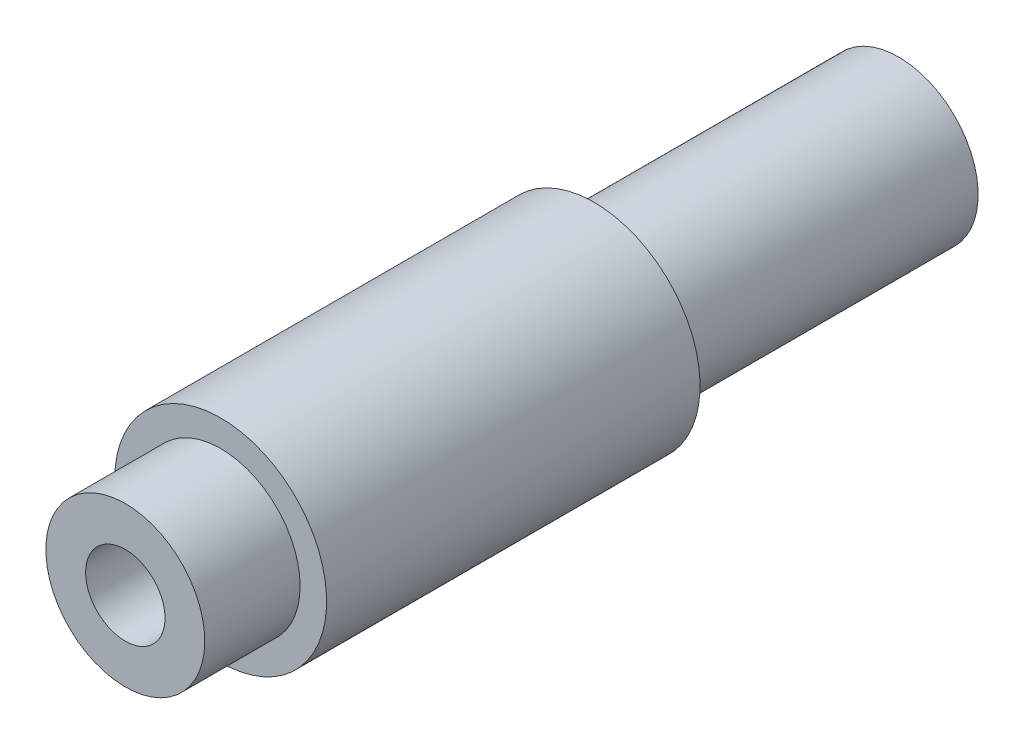
ISO-10303-21;
HEADER;
FILE_DESCRIPTION(('STEP AP214'),'2;1');
FILE_NAME('part.step','',(''),(''),'','','');
FILE_SCHEMA(('AUTOMOTIVE_DESIGN { 1 0 10303 214 1 1 1 1 }'));
ENDSEC;
DATA;
#1=APPLICATION_CONTEXT('core data for automotive mechanical design processes');
#2=APPLICATION_PROTOCOL_DEFINITION('international standard','automotive_design',2000,#1);
#3=PRODUCT_CONTEXT('',#1,'mechanical');
#4=PRODUCT('Part','Part','',(#3));
#5=PRODUCT_RELATED_PRODUCT_CATEGORY('part','',(#4));
#6=PRODUCT_DEFINITION_FORMATION('','',#4);
#7=PRODUCT_DEFINITION_CONTEXT('part definition',#1,'design');
#8=PRODUCT_DEFINITION('design','',#6,#7);
#9=PRODUCT_DEFINITION_SHAPE('','',#8);
#10=(LENGTH_UNIT() NAMED_UNIT(*) SI_UNIT(.MILLI.,.METRE.));
#11=(NAMED_UNIT(*) PLANE_ANGLE_UNIT() SI_UNIT($,.RADIAN.));
#12=(NAMED_UNIT(*) SI_UNIT($,.STERADIAN.) SOLID_ANGLE_UNIT());
#13=UNCERTAINTY_MEASURE_WITH_UNIT(LENGTH_MEASURE(1.E-05),#10,'distance_accuracy_value','');
#14=(GEOMETRIC_REPRESENTATION_CONTEXT(3) GLOBAL_UNCERTAINTY_ASSIGNED_CONTEXT((#13)) GLOBAL_UNIT_ASSIGNED_CONTEXT((#10,
#11,#12)) REPRESENTATION_CONTEXT('',''));
#15=CARTESIAN_POINT('',(0.,0.,0.));
#16=DIRECTION('',(0.,0.,1.));
#17=DIRECTION('',(1.,0.,0.));
#18=AXIS2_PLACEMENT_3D('',#15,#16,#17);
#19=CARTESIAN_POINT('',(0.,0.,29.2));
#20=DIRECTION('',(0.,0.,-1.));
#21=DIRECTION('',(-1.,0.,0.));
#22=AXIS2_PLACEMENT_3D('',#19,#20,#21);
#23=CYLINDRICAL_SURFACE('',#22,4.);
#24=CARTESIAN_POINT('',(0.,0.,11.5));
#25=DIRECTION('',(0.,0.,-1.));
#26=DIRECTION('',(-1.,0.,0.));
#27=AXIS2_PLACEMENT_3D('',#24,#25,#26);
#28=CIRCLE('',#27,4.);
#29=CARTESIAN_POINT('',(-4.,0.,11.5));
#30=VERTEX_POINT('',#29);
#31=EDGE_CURVE('E43',#30,#30,#28,.T.);
#32=CARTESIAN_POINT('',(0.,0.,25.6));
#33=DIRECTION('',(0.,0.,1.));
#34=DIRECTION('',(1.,0.,0.));
#35=AXIS2_PLACEMENT_3D('',#32,#33,#34);
#36=CIRCLE('',#35,4.);
#37=CARTESIAN_POINT('',(-4.,0.,25.6));
#38=VERTEX_POINT('',#37);
#39=EDGE_CURVE('E49',#38,#38,#36,.T.);
#40=CARTESIAN_POINT('',(-4.,0.,11.5));
#41=CARTESIAN_POINT('',(-4.,0.,11.646875));
#42=CARTESIAN_POINT('',(-4.,0.,11.79375));
#43=CARTESIAN_POINT('',(-4.,0.,12.0875));
#44=CARTESIAN_POINT('',(-4.,0.,12.234375));
#45=CARTESIAN_POINT('',(-4.,0.,12.528125));
#46=CARTESIAN_POINT('',(-4.,0.,12.675));
#47=CARTESIAN_POINT('',(-4.,0.,12.96875));
#48=CARTESIAN_POINT('',(-4.,0.,13.115625));
#49=CARTESIAN_POINT('',(-4.,0.,13.409375));
#50=CARTESIAN_POINT('',(-4.,0.,13.55625));
#51=CARTESIAN_POINT('',(-4.,0.,13.85));
#52=CARTESIAN_POINT('',(-4.,0.,13.996875));
#53=CARTESIAN_POINT('',(-4.,0.,14.290625));
#54=CARTESIAN_POINT('',(-4.,0.,14.4375));
#55=CARTESIAN_POINT('',(-4.,0.,14.73125));
#56=CARTESIAN_POINT('',(-4.,0.,14.878125));
#57=CARTESIAN_POINT('',(-4.,0.,15.171875));
#58=CARTESIAN_POINT('',(-4.,0.,15.31875));
#59=CARTESIAN_POINT('',(-4.,0.,15.6125));
#60=CARTESIAN_POINT('',(-4.,0.,15.759375));
#61=CARTESIAN_POINT('',(-4.,0.,16.053125));
#62=CARTESIAN_POINT('',(-4.,0.,16.2));
#63=CARTESIAN_POINT('',(-4.,0.,16.49375));
#64=CARTESIAN_POINT('',(-4.,0.,16.640625));
#65=CARTESIAN_POINT('',(-4.,0.,16.934375));
#66=CARTESIAN_POINT('',(-4.,0.,17.08125));
#67=CARTESIAN_POINT('',(-4.,0.,17.375));
#68=CARTESIAN_POINT('',(-4.,0.,17.521875));
#69=CARTESIAN_POINT('',(-4.,0.,17.815625));
#70=CARTESIAN_POINT('',(-4.,0.,17.9625));
#71=CARTESIAN_POINT('',(-4.,0.,18.25625));
#72=CARTESIAN_POINT('',(-4.,0.,18.403125));
#73=CARTESIAN_POINT('',(-4.,0.,18.696875));
#74=CARTESIAN_POINT('',(-4.,0.,18.84375));
#75=CARTESIAN_POINT('',(-4.,0.,19.1375));
#76=CARTESIAN_POINT('',(-4.,0.,19.284375));
#77=CARTESIAN_POINT('',(-4.,0.,19.578125));
#78=CARTESIAN_POINT('',(-4.,0.,19.725));
#79=CARTESIAN_POINT('',(-4.,0.,20.01875));
#80=CARTESIAN_POINT('',(-4.,0.,20.165625));
#81=CARTESIAN_POINT('',(-4.,0.,20.459375));
#82=CARTESIAN_POINT('',(-4.,0.,20.60625));
#83=CARTESIAN_POINT('',(-4.,0.,20.9));
#84=CARTESIAN_POINT('',(-4.,0.,21.046875));
#85=CARTESIAN_POINT('',(-4.,0.,21.340625));
#86=CARTESIAN_POINT('',(-4.,0.,21.4875));
#87=CARTESIAN_POINT('',(-4.,0.,21.78125));
#88=CARTESIAN_POINT('',(-4.,0.,21.928125));
#89=CARTESIAN_POINT('',(-4.,0.,22.221875));
#90=CARTESIAN_POINT('',(-4.,0.,22.36875));
#91=CARTESIAN_POINT('',(-4.,0.,22.6625));
#92=CARTESIAN_POINT('',(-4.,0.,22.809375));
#93=CARTESIAN_POINT('',(-4.,0.,23.103125));
#94=CARTESIAN_POINT('',(-4.,0.,23.25));
#95=CARTESIAN_POINT('',(-4.,0.,23.54375));
#96=CARTESIAN_POINT('',(-4.,0.,23.690625));
#97=CARTESIAN_POINT('',(-4.,0.,23.984375));
#98=CARTESIAN_POINT('',(-4.,0.,24.13125));
#99=CARTESIAN_POINT('',(-4.,0.,24.425));
#100=CARTESIAN_POINT('',(-4.,0.,24.571875));
#101=CARTESIAN_POINT('',(-4.,0.,24.865625));
#102=CARTESIAN_POINT('',(-4.,0.,25.0125));
#103=CARTESIAN_POINT('',(-4.,0.,25.30625));
#104=CARTESIAN_POINT('',(-4.,0.,25.453125));
#105=CARTESIAN_POINT('',(-4.,0.,25.6));
#106=B_SPLINE_CURVE_WITH_KNOTS('',3,(#40,#41,#42,#43,#44,#45,#46,#47,#48,#49,#50,#51,#52,#53,
#54,#55,#56,#57,#58,#59,#60,#61,#62,#63,#64,#65,#66,#67,#68,#69,#70,#71,#72,#73,#74,#75,#76,#77,
#78,#79,#80,#81,#82,#83,#84,#85,#86,#87,#88,#89,#90,#91,#92,#93,#94,#95,#96,#97,#98,#99,#100,
#101,#102,#103,#104,#105),.UNSPECIFIED.,.F.,.F.,(4,2,2,2,2,2,2,2,2,2,2,2,2,2,2,2,2,2,2,2,2,2,2,
2,2,2,2,2,2,2,2,2,4),(0.,0.440625,0.88125,1.321875,1.7625,2.203125,2.64375,3.084375,3.525,
3.965625,4.40625,4.846875,5.2875,5.728125,6.16875,6.609375,7.05,7.490625,7.93125,8.371875,
8.8125,9.253125,9.69375,10.134375,10.575,11.015625,11.45625,11.896875,12.3375,12.778125,
13.21875,13.659375,14.1),.UNSPECIFIED.);
#107=EDGE_CURVE('BSEAM33',#30,#38,#106,.T.);
#108=ORIENTED_EDGE('',*,*,#31,.F.);
#109=ORIENTED_EDGE('',*,*,#39,.F.);
#110=ORIENTED_EDGE('',*,*,#107,.T.);
#111=ORIENTED_EDGE('',*,*,#107,.F.);
#112=EDGE_LOOP('',(#108,#110,#109,#111));
#113=FACE_BOUND('',#112,.T.);
#114=ADVANCED_FACE('F33',(#113),#23,.T.);
#115=CARTESIAN_POINT('',(0.,0.,29.2));
#116=DIRECTION('',(0.,0.,1.));
#117=DIRECTION('',(1.,0.,0.));
#118=AXIS2_PLACEMENT_3D('',#115,#116,#117);
#119=PLANE('',#118);
#120=CARTESIAN_POINT('',(0.,0.,29.2));
#121=DIRECTION('',(0.,0.,1.));
#122=DIRECTION('',(1.,0.,0.));
#123=AXIS2_PLACEMENT_3D('',#120,#121,#122);
#124=CIRCLE('',#123,1.5);
#125=CARTESIAN_POINT('',(-1.5,0.,29.2));
#126=VERTEX_POINT('',#125);
#127=EDGE_CURVE('E10',#126,#126,#124,.T.);
#128=ORIENTED_EDGE('',*,*,#127,.F.);
#129=EDGE_LOOP('',(#128));
#130=FACE_BOUND('',#129,.T.);
#131=CARTESIAN_POINT('',(0.,0.,29.2));
#132=DIRECTION('',(0.,0.,1.));
#133=DIRECTION('',(1.,0.,0.));
#134=AXIS2_PLACEMENT_3D('',#131,#132,#133);
#135=CIRCLE('',#134,3.);
#136=CARTESIAN_POINT('',(3.,0.,29.2));
#137=VERTEX_POINT('',#136);
#138=EDGE_CURVE('E57',#137,#137,#135,.T.);
#139=ORIENTED_EDGE('',*,*,#138,.T.);
#140=EDGE_LOOP('',(#139));
#141=FACE_BOUND('',#140,.T.);
#142=ADVANCED_FACE('F74',(#130,#141),#119,.T.);
#143=CARTESIAN_POINT('',(0.,0.,0.));
#144=DIRECTION('',(0.,0.,1.));
#145=DIRECTION('',(1.,0.,0.));
#146=AXIS2_PLACEMENT_3D('',#143,#144,#145);
#147=PLANE('',#146);
#148=CARTESIAN_POINT('',(0.,0.,0.));
#149=DIRECTION('',(0.,0.,1.));
#150=DIRECTION('',(1.,0.,0.));
#151=AXIS2_PLACEMENT_3D('',#148,#149,#150);
#152=CIRCLE('',#151,1.5);
#153=CARTESIAN_POINT('',(-1.5,0.,0.));
#154=VERTEX_POINT('',#153);
#155=EDGE_CURVE('E36',#154,#154,#152,.T.);
#156=ORIENTED_EDGE('',*,*,#155,.T.);
#157=EDGE_LOOP('',(#156));
#158=FACE_BOUND('',#157,.T.);
#159=CARTESIAN_POINT('',(0.,0.,0.));
#160=DIRECTION('',(0.,0.,-1.));
#161=DIRECTION('',(-1.,0.,0.));
#162=AXIS2_PLACEMENT_3D('',#159,#160,#161);
#163=CIRCLE('',#162,3.);
#164=CARTESIAN_POINT('',(-3.,0.,0.));
#165=VERTEX_POINT('',#164);
#166=EDGE_CURVE('E45',#165,#165,#163,.T.);
#167=ORIENTED_EDGE('',*,*,#166,.T.);
#168=EDGE_LOOP('',(#167));
#169=FACE_BOUND('',#168,.T.);
#170=ADVANCED_FACE('F79',(#158,#169),#147,.F.);
#171=CARTESIAN_POINT('',(0.,0.,29.2));
#172=DIRECTION('',(0.,0.,-1.));
#173=DIRECTION('',(-1.,0.,0.));
#174=AXIS2_PLACEMENT_3D('',#171,#172,#173);
#175=CYLINDRICAL_SURFACE('',#174,1.5);
#176=CARTESIAN_POINT('',(-1.5,0.,29.2));
#177=CARTESIAN_POINT('',(-1.5,0.,28.8958333333333));
#178=CARTESIAN_POINT('',(-1.5,0.,28.5916666666667));
#179=CARTESIAN_POINT('',(-1.5,0.,27.9833333333333));
#180=CARTESIAN_POINT('',(-1.5,0.,27.6791666666667));
#181=CARTESIAN_POINT('',(-1.5,0.,27.0708333333333));
#182=CARTESIAN_POINT('',(-1.5,0.,26.7666666666667));
#183=CARTESIAN_POINT('',(-1.5,0.,26.1583333333333));
#184=CARTESIAN_POINT('',(-1.5,0.,25.8541666666667));
#185=CARTESIAN_POINT('',(-1.5,0.,25.2458333333333));
#186=CARTESIAN_POINT('',(-1.5,0.,24.9416666666667));
#187=CARTESIAN_POINT('',(-1.5,0.,24.3333333333333));
#188=CARTESIAN_POINT('',(-1.5,0.,24.0291666666667));
#189=CARTESIAN_POINT('',(-1.5,0.,23.4208333333333));
#190=CARTESIAN_POINT('',(-1.5,0.,23.1166666666667));
#191=CARTESIAN_POINT('',(-1.5,0.,22.5083333333333));
#192=CARTESIAN_POINT('',(-1.5,0.,22.2041666666667));
#193=CARTESIAN_POINT('',(-1.5,0.,21.5958333333333));
#194=CARTESIAN_POINT('',(-1.5,0.,21.2916666666667));
#195=CARTESIAN_POINT('',(-1.5,0.,20.6833333333333));
#196=CARTESIAN_POINT('',(-1.5,0.,20.3791666666667));
#197=CARTESIAN_POINT('',(-1.5,0.,19.7708333333333));
#198=CARTESIAN_POINT('',(-1.5,0.,19.4666666666667));
#199=CARTESIAN_POINT('',(-1.5,0.,18.8583333333333));
#200=CARTESIAN_POINT('',(-1.5,0.,18.5541666666667));
#201=CARTESIAN_POINT('',(-1.5,0.,17.9458333333333));
#202=CARTESIAN_POINT('',(-1.5,0.,17.6416666666667));
#203=CARTESIAN_POINT('',(-1.5,0.,17.0333333333333));
#204=CARTESIAN_POINT('',(-1.5,0.,16.7291666666667));
#205=CARTESIAN_POINT('',(-1.5,0.,16.1208333333333));
#206=CARTESIAN_POINT('',(-1.5,0.,15.8166666666667));
#207=CARTESIAN_POINT('',(-1.5,0.,15.2083333333333));
#208=CARTESIAN_POINT('',(-1.5,0.,14.9041666666667));
#209=CARTESIAN_POINT('',(-1.5,0.,14.2958333333333));
#210=CARTESIAN_POINT('',(-1.5,0.,13.9916666666667));
#211=CARTESIAN_POINT('',(-1.5,0.,13.3833333333333));
#212=CARTESIAN_POINT('',(-1.5,0.,13.0791666666667));
#213=CARTESIAN_POINT('',(-1.5,0.,12.4708333333333));
#214=CARTESIAN_POINT('',(-1.5,0.,12.1666666666667));
#215=CARTESIAN_POINT('',(-1.5,0.,11.5583333333333));
#216=CARTESIAN_POINT('',(-1.5,0.,11.2541666666667));
#217=CARTESIAN_POINT('',(-1.5,0.,10.6458333333333));
#218=CARTESIAN_POINT('',(-1.5,0.,10.3416666666667));
#219=CARTESIAN_POINT('',(-1.5,0.,9.73333333333333));
#220=CARTESIAN_POINT('',(-1.5,0.,9.42916666666666));
#221=CARTESIAN_POINT('',(-1.5,0.,8.82083333333333));
#222=CARTESIAN_POINT('',(-1.5,0.,8.51666666666666));
#223=CARTESIAN_POINT('',(-1.5,0.,7.90833333333333));
#224=CARTESIAN_POINT('',(-1.5,0.,7.60416666666666));
#225=CARTESIAN_POINT('',(-1.5,0.,6.99583333333333));
#226=CARTESIAN_POINT('',(-1.5,0.,6.69166666666666));
#227=CARTESIAN_POINT('',(-1.5,0.,6.08333333333333));
#228=CARTESIAN_POINT('',(-1.5,0.,5.77916666666666));
#229=CARTESIAN_POINT('',(-1.5,0.,5.17083333333333));
#230=CARTESIAN_POINT('',(-1.5,0.,4.86666666666666));
#231=CARTESIAN_POINT('',(-1.5,0.,4.25833333333333));
#232=CARTESIAN_POINT('',(-1.5,0.,3.95416666666666));
#233=CARTESIAN_POINT('',(-1.5,0.,3.34583333333333));
#234=CARTESIAN_POINT('',(-1.5,0.,3.04166666666666));
#235=CARTESIAN_POINT('',(-1.5,0.,2.43333333333333));
#236=CARTESIAN_POINT('',(-1.5,0.,2.12916666666666));
#237=CARTESIAN_POINT('',(-1.5,0.,1.52083333333333));
#238=CARTESIAN_POINT('',(-1.5,0.,1.21666666666666));
#239=CARTESIAN_POINT('',(-1.5,0.,0.60833333333333));
#240=CARTESIAN_POINT('',(-1.5,0.,0.304166666666663));
#241=CARTESIAN_POINT('',(-1.5,0.,0.));
#242=B_SPLINE_CURVE_WITH_KNOTS('',3,(#176,#177,#178,#179,#180,#181,#182,#183,#184,#185,#186,
#187,#188,#189,#190,#191,#192,#193,#194,#195,#196,#197,#198,#199,#200,#201,#202,#203,#204,#205,
#206,#207,#208,#209,#210,#211,#212,#213,#214,#215,#216,#217,#218,#219,#220,#221,#222,#223,#224,
#225,#226,#227,#228,#229,#230,#231,#232,#233,#234,#235,#236,#237,#238,#239,#240,#241),
.UNSPECIFIED.,.F.,.F.,(4,2,2,2,2,2,2,2,2,2,2,2,2,2,2,2,2,2,2,2,2,2,2,2,2,2,2,2,2,2,2,2,4),(0.,
0.9125,1.825,2.7375,3.65,4.5625,5.475,6.3875,7.3,8.2125,9.125,10.0375,10.95,11.8625,12.775,
13.6875,14.6,15.5125,16.425,17.3375,18.25,19.1625,20.075,20.9875,21.9,22.8125,23.725,24.6375,
25.55,26.4625,27.375,28.2875,29.2),.UNSPECIFIED.);
#243=EDGE_CURVE('BSEAM91',#126,#154,#242,.T.);
#244=ORIENTED_EDGE('',*,*,#127,.T.);
#245=ORIENTED_EDGE('',*,*,#155,.F.);
#246=ORIENTED_EDGE('',*,*,#243,.T.);
#247=ORIENTED_EDGE('',*,*,#243,.F.);
#248=EDGE_LOOP('',(#244,#246,#245,#247));
#249=FACE_BOUND('',#248,.T.);
#250=ADVANCED_FACE('F91',(#249),#175,.F.);
#251=CARTESIAN_POINT('',(0.,0.,11.5));
#252=DIRECTION('',(0.,0.,-1.));
#253=DIRECTION('',(-1.,0.,0.));
#254=AXIS2_PLACEMENT_3D('',#251,#252,#253);
#255=CYLINDRICAL_SURFACE('',#254,3.);
#256=CARTESIAN_POINT('',(0.,0.,11.5));
#257=DIRECTION('',(0.,0.,-1.));
#258=DIRECTION('',(-1.,0.,0.));
#259=AXIS2_PLACEMENT_3D('',#256,#257,#258);
#260=CIRCLE('',#259,3.);
#261=CARTESIAN_POINT('',(-3.,0.,11.5));
#262=VERTEX_POINT('',#261);
#263=EDGE_CURVE('E48',#262,#262,#260,.T.);
#264=ORIENTED_EDGE('',*,*,#263,.T.);
#265=EDGE_LOOP('',(#264));
#266=FACE_BOUND('',#265,.T.);
#267=ORIENTED_EDGE('',*,*,#166,.F.);
#268=EDGE_LOOP('',(#267));
#269=FACE_BOUND('',#268,.T.);
#270=ADVANCED_FACE('F85',(#266,#269),#255,.T.);
#271=CARTESIAN_POINT('',(0.,0.,11.5));
#272=DIRECTION('',(0.,0.,-1.));
#273=DIRECTION('',(-1.,0.,0.));
#274=AXIS2_PLACEMENT_3D('',#271,#272,#273);
#275=PLANE('',#274);
#276=ORIENTED_EDGE('',*,*,#263,.F.);
#277=EDGE_LOOP('',(#276));
#278=FACE_BOUND('',#277,.T.);
#279=ORIENTED_EDGE('',*,*,#31,.T.);
#280=EDGE_LOOP('',(#279));
#281=FACE_BOUND('',#280,.T.);
#282=ADVANCED_FACE('F69',(#278,#281),#275,.T.);
#283=CARTESIAN_POINT('',(0.,0.,25.6));
#284=DIRECTION('',(0.,0.,1.));
#285=DIRECTION('',(1.,0.,0.));
#286=AXIS2_PLACEMENT_3D('',#283,#284,#285);
#287=PLANE('',#286);
#288=CARTESIAN_POINT('',(0.,0.,25.6));
#289=DIRECTION('',(0.,0.,1.));
#290=DIRECTION('',(1.,0.,0.));
#291=AXIS2_PLACEMENT_3D('',#288,#289,#290);
#292=CIRCLE('',#291,3.);
#293=CARTESIAN_POINT('',(3.,0.,25.6));
#294=VERTEX_POINT('',#293);
#295=EDGE_CURVE('E56',#294,#294,#292,.T.);
#296=ORIENTED_EDGE('',*,*,#295,.F.);
#297=EDGE_LOOP('',(#296));
#298=FACE_BOUND('',#297,.T.);
#299=ORIENTED_EDGE('',*,*,#39,.T.);
#300=EDGE_LOOP('',(#299));
#301=FACE_BOUND('',#300,.T.);
#302=ADVANCED_FACE('F66',(#298,#301),#287,.T.);
#303=CARTESIAN_POINT('',(0.,0.,25.6));
#304=DIRECTION('',(0.,0.,1.));
#305=DIRECTION('',(1.,0.,0.));
#306=AXIS2_PLACEMENT_3D('',#303,#304,#305);
#307=CYLINDRICAL_SURFACE('',#306,3.);
#308=ORIENTED_EDGE('',*,*,#295,.T.);
#309=EDGE_LOOP('',(#308));
#310=FACE_BOUND('',#309,.T.);
#311=ORIENTED_EDGE('',*,*,#138,.F.);
#312=EDGE_LOOP('',(#311));
#313=FACE_BOUND('',#312,.T.);
#314=ADVANCED_FACE('F63',(#310,#313),#307,.T.);
#315=CLOSED_SHELL('',(#114,#142,#170,#250,#270,#282,#302,#314));
#316=MANIFOLD_SOLID_BREP('B2',#315);
#317=ADVANCED_BREP_SHAPE_REPRESENTATION('',(#18,#316),#14);
#318=SHAPE_DEFINITION_REPRESENTATION(#9,#317);
ENDSEC;
END-ISO-10303-21;
